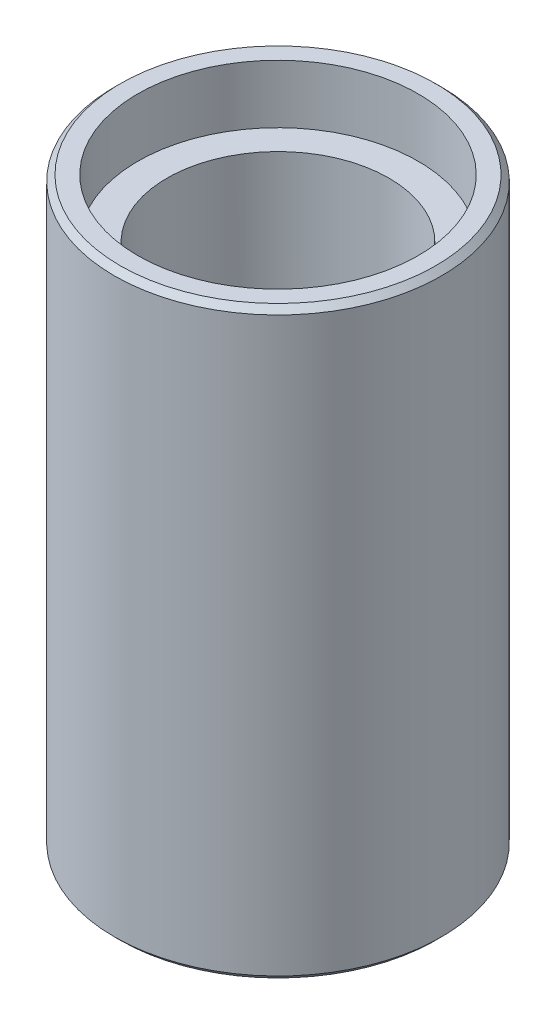
ISO-10303-21;
HEADER;
FILE_DESCRIPTION(('STEP AP214'),'2;1');
FILE_NAME('part.step','',(''),(''),'','','');
FILE_SCHEMA(('AUTOMOTIVE_DESIGN { 1 0 10303 214 1 1 1 1 }'));
ENDSEC;
DATA;
#1=APPLICATION_CONTEXT('core data for automotive mechanical design processes');
#2=APPLICATION_PROTOCOL_DEFINITION('international standard','automotive_design',2000,#1);
#3=PRODUCT_CONTEXT('',#1,'mechanical');
#4=PRODUCT('Part','Part','',(#3));
#5=PRODUCT_RELATED_PRODUCT_CATEGORY('part','',(#4));
#6=PRODUCT_DEFINITION_FORMATION('','',#4);
#7=PRODUCT_DEFINITION_CONTEXT('part definition',#1,'design');
#8=PRODUCT_DEFINITION('design','',#6,#7);
#9=PRODUCT_DEFINITION_SHAPE('','',#8);
#10=(LENGTH_UNIT() NAMED_UNIT(*) SI_UNIT(.MILLI.,.METRE.));
#11=(NAMED_UNIT(*) PLANE_ANGLE_UNIT() SI_UNIT($,.RADIAN.));
#12=(NAMED_UNIT(*) SI_UNIT($,.STERADIAN.) SOLID_ANGLE_UNIT());
#13=UNCERTAINTY_MEASURE_WITH_UNIT(LENGTH_MEASURE(1.E-05),#10,'distance_accuracy_value','');
#14=(GEOMETRIC_REPRESENTATION_CONTEXT(3) GLOBAL_UNCERTAINTY_ASSIGNED_CONTEXT((#13)) GLOBAL_UNIT_ASSIGNED_CONTEXT((#10,
#11,#12)) REPRESENTATION_CONTEXT('',''));
#15=CARTESIAN_POINT('',(0.,0.,0.));
#16=DIRECTION('',(0.,0.,1.));
#17=DIRECTION('',(1.,0.,0.));
#18=AXIS2_PLACEMENT_3D('',#15,#16,#17);
#19=CARTESIAN_POINT('',(0.,50.,0.));
#20=DIRECTION('',(0.,-1.,0.));
#21=DIRECTION('',(0.,0.,-1.));
#22=AXIS2_PLACEMENT_3D('',#19,#20,#21);
#23=CYLINDRICAL_SURFACE('',#22,14.);
#24=CARTESIAN_POINT('',(0.,0.499999999999987,0.));
#25=DIRECTION('',(0.,1.,0.));
#26=DIRECTION('',(0.,0.,1.));
#27=AXIS2_PLACEMENT_3D('',#24,#25,#26);
#28=CIRCLE('',#27,14.);
#29=CARTESIAN_POINT('',(0.,0.499999999999987,14.));
#30=VERTEX_POINT('',#29);
#31=EDGE_CURVE('E26',#30,#30,#28,.T.);
#32=ORIENTED_EDGE('',*,*,#31,.T.);
#33=EDGE_LOOP('',(#32));
#34=FACE_BOUND('',#33,.T.);
#35=CARTESIAN_POINT('',(0.,49.5,0.));
#36=DIRECTION('',(0.,1.,0.));
#37=DIRECTION('',(0.,0.,1.));
#38=AXIS2_PLACEMENT_3D('',#35,#36,#37);
#39=CIRCLE('',#38,14.);
#40=CARTESIAN_POINT('',(0.,49.5,14.));
#41=VERTEX_POINT('',#40);
#42=EDGE_CURVE('E30',#41,#41,#39,.F.);
#43=ORIENTED_EDGE('',*,*,#42,.T.);
#44=EDGE_LOOP('',(#43));
#45=FACE_BOUND('',#44,.T.);
#46=ADVANCED_FACE('F15',(#34,#45),#23,.T.);
#47=CARTESIAN_POINT('',(0.,50.,0.));
#48=DIRECTION('',(0.,1.,0.));
#49=DIRECTION('',(0.,0.,1.));
#50=AXIS2_PLACEMENT_3D('',#47,#48,#49);
#51=PLANE('',#50);
#52=CARTESIAN_POINT('',(0.,50.,0.));
#53=DIRECTION('',(0.,1.,0.));
#54=DIRECTION('',(0.,0.,1.));
#55=AXIS2_PLACEMENT_3D('',#52,#53,#54);
#56=CIRCLE('',#55,13.5);
#57=CARTESIAN_POINT('',(0.,50.,13.5));
#58=VERTEX_POINT('',#57);
#59=EDGE_CURVE('E10',#58,#58,#56,.T.);
#60=ORIENTED_EDGE('',*,*,#59,.T.);
#61=EDGE_LOOP('',(#60));
#62=FACE_BOUND('',#61,.T.);
#63=CARTESIAN_POINT('',(0.,50.,0.));
#64=DIRECTION('',(0.,1.,0.));
#65=DIRECTION('',(0.,0.,1.));
#66=AXIS2_PLACEMENT_3D('',#63,#64,#65);
#67=CIRCLE('',#66,12.);
#68=CARTESIAN_POINT('',(0.,50.,12.));
#69=VERTEX_POINT('',#68);
#70=EDGE_CURVE('E36',#69,#69,#67,.T.);
#71=ORIENTED_EDGE('',*,*,#70,.F.);
#72=EDGE_LOOP('',(#71));
#73=FACE_BOUND('',#72,.T.);
#74=ADVANCED_FACE('F72',(#62,#73),#51,.T.);
#75=CARTESIAN_POINT('',(0.,0.,0.));
#76=DIRECTION('',(0.,1.,0.));
#77=DIRECTION('',(0.,0.,1.));
#78=AXIS2_PLACEMENT_3D('',#75,#76,#77);
#79=PLANE('',#78);
#80=CARTESIAN_POINT('',(0.,0.,0.));
#81=DIRECTION('',(0.,1.,0.));
#82=DIRECTION('',(0.,0.,1.));
#83=AXIS2_PLACEMENT_3D('',#80,#81,#82);
#84=CIRCLE('',#83,13.5);
#85=CARTESIAN_POINT('',(0.,0.,13.5));
#86=VERTEX_POINT('',#85);
#87=EDGE_CURVE('E22',#86,#86,#84,.F.);
#88=ORIENTED_EDGE('',*,*,#87,.T.);
#89=EDGE_LOOP('',(#88));
#90=FACE_BOUND('',#89,.T.);
#91=CARTESIAN_POINT('',(0.,0.,0.));
#92=DIRECTION('',(0.,-1.,0.));
#93=DIRECTION('',(0.,0.,-1.));
#94=AXIS2_PLACEMENT_3D('',#91,#92,#93);
#95=CIRCLE('',#94,12.);
#96=CARTESIAN_POINT('',(0.,0.,-12.));
#97=VERTEX_POINT('',#96);
#98=EDGE_CURVE('E42',#97,#97,#95,.T.);
#99=ORIENTED_EDGE('',*,*,#98,.F.);
#100=EDGE_LOOP('',(#99));
#101=FACE_BOUND('',#100,.T.);
#102=ADVANCED_FACE('F69',(#90,#101),#79,.F.);
#103=CARTESIAN_POINT('',(0.,45.,0.));
#104=DIRECTION('',(0.,1.,0.));
#105=DIRECTION('',(0.,0.,1.));
#106=AXIS2_PLACEMENT_3D('',#103,#104,#105);
#107=CYLINDRICAL_SURFACE('',#106,12.);
#108=CARTESIAN_POINT('',(0.,45.,0.));
#109=DIRECTION('',(0.,1.,0.));
#110=DIRECTION('',(0.,0.,1.));
#111=AXIS2_PLACEMENT_3D('',#108,#109,#110);
#112=CIRCLE('',#111,12.);
#113=CARTESIAN_POINT('',(0.,45.,12.));
#114=VERTEX_POINT('',#113);
#115=EDGE_CURVE('E35',#114,#114,#112,.T.);
#116=ORIENTED_EDGE('',*,*,#115,.F.);
#117=EDGE_LOOP('',(#116));
#118=FACE_BOUND('',#117,.T.);
#119=ORIENTED_EDGE('',*,*,#70,.T.);
#120=EDGE_LOOP('',(#119));
#121=FACE_BOUND('',#120,.T.);
#122=ADVANCED_FACE('F71',(#118,#121),#107,.F.);
#123=CARTESIAN_POINT('',(0.,45.,0.));
#124=DIRECTION('',(0.,1.,0.));
#125=DIRECTION('',(0.,0.,1.));
#126=AXIS2_PLACEMENT_3D('',#123,#124,#125);
#127=PLANE('',#126);
#128=CARTESIAN_POINT('',(0.,45.,0.));
#129=DIRECTION('',(0.,1.,0.));
#130=DIRECTION('',(0.,0.,1.));
#131=AXIS2_PLACEMENT_3D('',#128,#129,#130);
#132=CIRCLE('',#131,9.5);
#133=CARTESIAN_POINT('',(0.,45.,9.5));
#134=VERTEX_POINT('',#133);
#135=EDGE_CURVE('E45',#134,#134,#132,.T.);
#136=ORIENTED_EDGE('',*,*,#135,.F.);
#137=EDGE_LOOP('',(#136));
#138=FACE_BOUND('',#137,.T.);
#139=ORIENTED_EDGE('',*,*,#115,.T.);
#140=EDGE_LOOP('',(#139));
#141=FACE_BOUND('',#140,.T.);
#142=ADVANCED_FACE('F65',(#138,#141),#127,.T.);
#143=CARTESIAN_POINT('',(0.,5.,0.));
#144=DIRECTION('',(0.,-1.,0.));
#145=DIRECTION('',(0.,0.,-1.));
#146=AXIS2_PLACEMENT_3D('',#143,#144,#145);
#147=CYLINDRICAL_SURFACE('',#146,12.);
#148=CARTESIAN_POINT('',(0.,5.,0.));
#149=DIRECTION('',(0.,-1.,0.));
#150=DIRECTION('',(0.,0.,-1.));
#151=AXIS2_PLACEMENT_3D('',#148,#149,#150);
#152=CIRCLE('',#151,12.);
#153=CARTESIAN_POINT('',(0.,5.,-12.));
#154=VERTEX_POINT('',#153);
#155=EDGE_CURVE('E39',#154,#154,#152,.T.);
#156=ORIENTED_EDGE('',*,*,#155,.F.);
#157=EDGE_LOOP('',(#156));
#158=FACE_BOUND('',#157,.T.);
#159=ORIENTED_EDGE('',*,*,#98,.T.);
#160=EDGE_LOOP('',(#159));
#161=FACE_BOUND('',#160,.T.);
#162=ADVANCED_FACE('F59',(#158,#161),#147,.F.);
#163=CARTESIAN_POINT('',(0.,5.,0.));
#164=DIRECTION('',(0.,-1.,0.));
#165=DIRECTION('',(0.,0.,-1.));
#166=AXIS2_PLACEMENT_3D('',#163,#164,#165);
#167=PLANE('',#166);
#168=CARTESIAN_POINT('',(0.,5.,0.));
#169=DIRECTION('',(0.,-1.,0.));
#170=DIRECTION('',(0.,0.,-1.));
#171=AXIS2_PLACEMENT_3D('',#168,#169,#170);
#172=CIRCLE('',#171,9.5);
#173=CARTESIAN_POINT('',(0.,5.,-9.5));
#174=VERTEX_POINT('',#173);
#175=EDGE_CURVE('E50',#174,#174,#172,.T.);
#176=ORIENTED_EDGE('',*,*,#175,.F.);
#177=EDGE_LOOP('',(#176));
#178=FACE_BOUND('',#177,.T.);
#179=ORIENTED_EDGE('',*,*,#155,.T.);
#180=EDGE_LOOP('',(#179));
#181=FACE_BOUND('',#180,.T.);
#182=ADVANCED_FACE('F56',(#178,#181),#167,.T.);
#183=CARTESIAN_POINT('',(0.,50.,0.));
#184=DIRECTION('',(0.,-1.,0.));
#185=DIRECTION('',(0.,0.,-1.));
#186=AXIS2_PLACEMENT_3D('',#183,#184,#185);
#187=CYLINDRICAL_SURFACE('',#186,9.5);
#188=ORIENTED_EDGE('',*,*,#135,.T.);
#189=EDGE_LOOP('',(#188));
#190=FACE_BOUND('',#189,.T.);
#191=ORIENTED_EDGE('',*,*,#175,.T.);
#192=EDGE_LOOP('',(#191));
#193=FACE_BOUND('',#192,.T.);
#194=ADVANCED_FACE('F54',(#190,#193),#187,.F.);
#195=CARTESIAN_POINT('',(0.,0.499999999999987,0.));
#196=DIRECTION('',(0.,1.,0.));
#197=DIRECTION('',(0.,0.,1.));
#198=AXIS2_PLACEMENT_3D('',#195,#196,#197);
#199=CONICAL_SURFACE('',#198,14.,0.785398163397457);
#200=ORIENTED_EDGE('',*,*,#87,.F.);
#201=EDGE_LOOP('',(#200));
#202=FACE_BOUND('',#201,.T.);
#203=ORIENTED_EDGE('',*,*,#31,.F.);
#204=EDGE_LOOP('',(#203));
#205=FACE_BOUND('',#204,.T.);
#206=ADVANCED_FACE('F90',(#202,#205),#199,.T.);
#207=CARTESIAN_POINT('',(0.,50.,0.));
#208=DIRECTION('',(0.,-1.,0.));
#209=DIRECTION('',(0.,0.,-1.));
#210=AXIS2_PLACEMENT_3D('',#207,#208,#209);
#211=CONICAL_SURFACE('',#210,13.5,0.785398163397457);
#212=ORIENTED_EDGE('',*,*,#42,.F.);
#213=EDGE_LOOP('',(#212));
#214=FACE_BOUND('',#213,.T.);
#215=ORIENTED_EDGE('',*,*,#59,.F.);
#216=EDGE_LOOP('',(#215));
#217=FACE_BOUND('',#216,.T.);
#218=ADVANCED_FACE('F17',(#214,#217),#211,.T.);
#219=CLOSED_SHELL('',(#46,#74,#102,#122,#142,#162,#182,#194,#206,#218));
#220=MANIFOLD_SOLID_BREP('B1',#219);
#221=ADVANCED_BREP_SHAPE_REPRESENTATION('',(#18,#220),#14);
#222=SHAPE_DEFINITION_REPRESENTATION(#9,#221);
ENDSEC;
END-ISO-10303-21;
